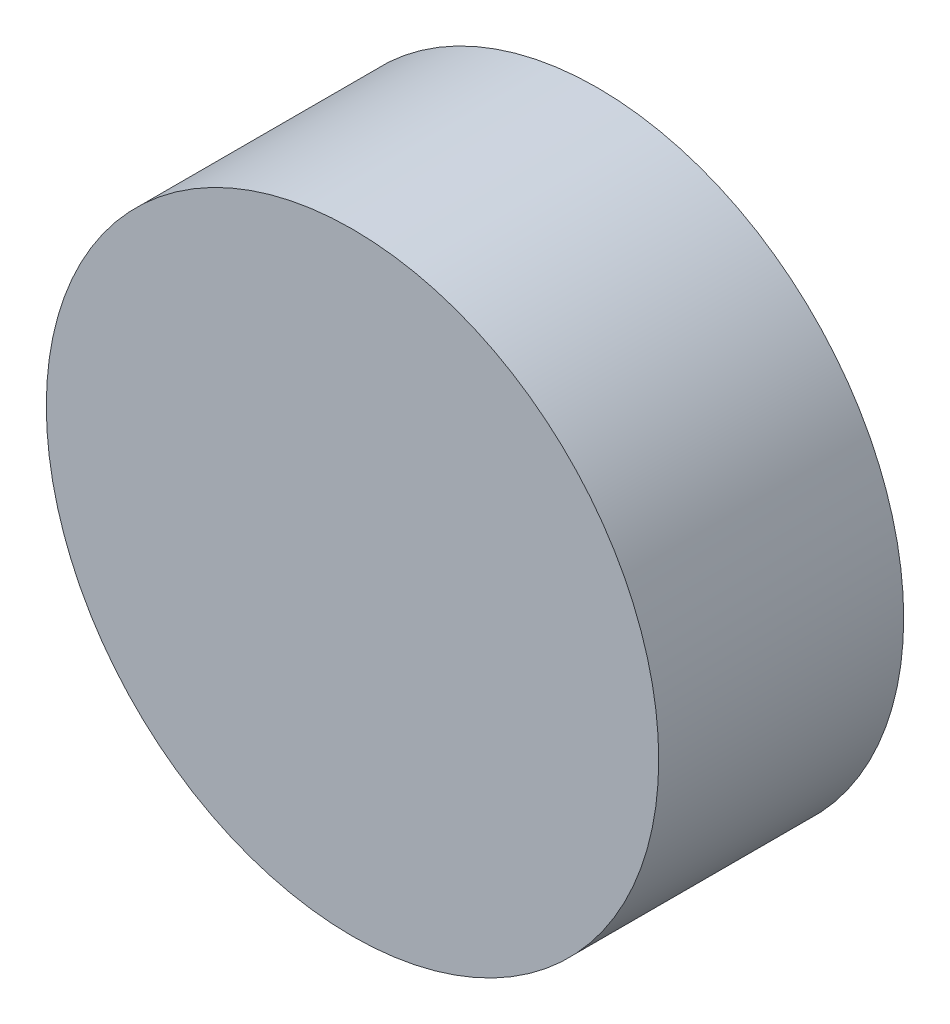
ISO-10303-21;
HEADER;
FILE_DESCRIPTION(('STEP AP214'),'2;1');
FILE_NAME('part.step','',(''),(''),'','','');
FILE_SCHEMA(('AUTOMOTIVE_DESIGN { 1 0 10303 214 1 1 1 1 }'));
ENDSEC;
DATA;
#1=APPLICATION_CONTEXT('core data for automotive mechanical design processes');
#2=APPLICATION_PROTOCOL_DEFINITION('international standard','automotive_design',2000,#1);
#3=PRODUCT_CONTEXT('',#1,'mechanical');
#4=PRODUCT('Part','Part','',(#3));
#5=PRODUCT_RELATED_PRODUCT_CATEGORY('part','',(#4));
#6=PRODUCT_DEFINITION_FORMATION('','',#4);
#7=PRODUCT_DEFINITION_CONTEXT('part definition',#1,'design');
#8=PRODUCT_DEFINITION('design','',#6,#7);
#9=PRODUCT_DEFINITION_SHAPE('','',#8);
#10=(LENGTH_UNIT() NAMED_UNIT(*) SI_UNIT(.MILLI.,.METRE.));
#11=(NAMED_UNIT(*) PLANE_ANGLE_UNIT() SI_UNIT($,.RADIAN.));
#12=(NAMED_UNIT(*) SI_UNIT($,.STERADIAN.) SOLID_ANGLE_UNIT());
#13=UNCERTAINTY_MEASURE_WITH_UNIT(LENGTH_MEASURE(1.E-05),#10,'distance_accuracy_value','');
#14=(GEOMETRIC_REPRESENTATION_CONTEXT(3) GLOBAL_UNCERTAINTY_ASSIGNED_CONTEXT((#13)) GLOBAL_UNIT_ASSIGNED_CONTEXT((#10,
#11,#12)) REPRESENTATION_CONTEXT('',''));
#15=CARTESIAN_POINT('',(0.,0.,0.));
#16=DIRECTION('',(0.,0.,1.));
#17=DIRECTION('',(1.,0.,0.));
#18=AXIS2_PLACEMENT_3D('',#15,#16,#17);
#19=CARTESIAN_POINT('',(-10.,0.,8.));
#20=DIRECTION('',(0.,0.,-1.));
#21=DIRECTION('',(-1.,0.,0.));
#22=AXIS2_PLACEMENT_3D('',#19,#20,#21);
#23=PLANE('',#22);
#24=CARTESIAN_POINT('',(0.,0.,8.));
#25=DIRECTION('',(0.,0.,1.));
#26=DIRECTION('',(1.,0.,0.));
#27=AXIS2_PLACEMENT_3D('',#24,#25,#26);
#28=CIRCLE('',#27,10.);
#29=CARTESIAN_POINT('',(10.,0.,8.));
#30=VERTEX_POINT('',#29);
#31=EDGE_CURVE('E95',#30,#30,#28,.T.);
#32=ORIENTED_EDGE('',*,*,#31,.T.);
#33=EDGE_LOOP('',(#32));
#34=FACE_BOUND('',#33,.T.);
#35=ADVANCED_FACE('F35',(#34),#23,.F.);
#36=CARTESIAN_POINT('',(0.,0.,0.));
#37=DIRECTION('',(0.,0.,1.));
#38=DIRECTION('',(1.,0.,0.));
#39=AXIS2_PLACEMENT_3D('',#36,#37,#38);
#40=PLANE('',#39);
#41=DIRECTION('',(1.,0.,0.));
#42=VECTOR('',#41,1.);
#43=CARTESIAN_POINT('',(0.,-2.,0.));
#44=LINE('',#43,#42);
#45=CARTESIAN_POINT('',(-1.66132477258362,-2.,0.));
#46=VERTEX_POINT('',#45);
#47=CARTESIAN_POINT('',(1.66132477258362,-2.,0.));
#48=VERTEX_POINT('',#47);
#49=EDGE_CURVE('E56',#46,#48,#44,.T.);
#50=ORIENTED_EDGE('',*,*,#49,.T.);
#51=CARTESIAN_POINT('',(0.,0.,0.));
#52=DIRECTION('',(0.,0.,1.));
#53=DIRECTION('',(1.,0.,0.));
#54=AXIS2_PLACEMENT_3D('',#51,#52,#53);
#55=CIRCLE('',#54,2.6);
#56=EDGE_CURVE('E49',#48,#46,#55,.T.);
#57=ORIENTED_EDGE('',*,*,#56,.T.);
#58=EDGE_LOOP('',(#50,#57));
#59=FACE_BOUND('',#58,.T.);
#60=CARTESIAN_POINT('',(0.,0.,0.));
#61=DIRECTION('',(0.,0.,1.));
#62=DIRECTION('',(1.,0.,0.));
#63=AXIS2_PLACEMENT_3D('',#60,#61,#62);
#64=CIRCLE('',#63,10.);
#65=CARTESIAN_POINT('',(10.,0.,0.));
#66=VERTEX_POINT('',#65);
#67=EDGE_CURVE('E99',#66,#66,#64,.T.);
#68=ORIENTED_EDGE('',*,*,#67,.F.);
#69=EDGE_LOOP('',(#68));
#70=FACE_BOUND('',#69,.T.);
#71=ADVANCED_FACE('F116',(#59,#70),#40,.F.);
#72=CARTESIAN_POINT('',(0.,0.,10.353242845035));
#73=DIRECTION('',(0.,0.,1.));
#74=DIRECTION('',(1.,0.,0.));
#75=AXIS2_PLACEMENT_3D('',#72,#73,#74);
#76=CYLINDRICAL_SURFACE('',#75,10.);
#77=ORIENTED_EDGE('',*,*,#31,.F.);
#78=EDGE_LOOP('',(#77));
#79=FACE_BOUND('',#78,.T.);
#80=ORIENTED_EDGE('',*,*,#67,.T.);
#81=EDGE_LOOP('',(#80));
#82=FACE_BOUND('',#81,.T.);
#83=ADVANCED_FACE('F120',(#79,#82),#76,.T.);
#84=CARTESIAN_POINT('',(0.,0.,6.));
#85=DIRECTION('',(0.,0.,-1.));
#86=DIRECTION('',(-1.,0.,0.));
#87=AXIS2_PLACEMENT_3D('',#84,#85,#86);
#88=CYLINDRICAL_SURFACE('',#87,1.6);
#89=DIRECTION('',(0.,0.,-1.));
#90=VECTOR('',#89,1.);
#91=CARTESIAN_POINT('',(-1.24899959967968,-1.,6.));
#92=LINE('',#91,#90);
#93=CARTESIAN_POINT('',(-1.24899959967968,-1.,6.));
#94=VERTEX_POINT('',#93);
#95=CARTESIAN_POINT('',(-1.24899959967968,-1.,1.));
#96=VERTEX_POINT('',#95);
#97=EDGE_CURVE('E86',#94,#96,#92,.T.);
#98=ORIENTED_EDGE('',*,*,#97,.T.);
#99=CARTESIAN_POINT('',(0.,0.,1.));
#100=DIRECTION('',(0.,0.,1.));
#101=DIRECTION('',(1.,0.,0.));
#102=AXIS2_PLACEMENT_3D('',#99,#100,#101);
#103=CIRCLE('',#102,1.6);
#104=CARTESIAN_POINT('',(1.24899959967968,-1.,1.));
#105=VERTEX_POINT('',#104);
#106=EDGE_CURVE('E83',#96,#105,#103,.F.);
#107=ORIENTED_EDGE('',*,*,#106,.T.);
#108=DIRECTION('',(0.,0.,-1.));
#109=VECTOR('',#108,1.);
#110=CARTESIAN_POINT('',(1.24899959967968,-1.,6.));
#111=LINE('',#110,#109);
#112=CARTESIAN_POINT('',(1.24899959967968,-1.,6.));
#113=VERTEX_POINT('',#112);
#114=EDGE_CURVE('E77',#113,#105,#111,.T.);
#115=ORIENTED_EDGE('',*,*,#114,.F.);
#116=CARTESIAN_POINT('',(0.,0.,6.));
#117=DIRECTION('',(0.,0.,-1.));
#118=DIRECTION('',(-1.,0.,0.));
#119=AXIS2_PLACEMENT_3D('',#116,#117,#118);
#120=CIRCLE('',#119,1.6);
#121=EDGE_CURVE('E81',#94,#113,#120,.T.);
#122=ORIENTED_EDGE('',*,*,#121,.F.);
#123=EDGE_LOOP('',(#98,#107,#115,#122));
#124=FACE_BOUND('',#123,.T.);
#125=ADVANCED_FACE('F80',(#124),#88,.F.);
#126=CARTESIAN_POINT('',(-1.24899959967968,-1.,6.));
#127=DIRECTION('',(0.,-1.,0.));
#128=DIRECTION('',(0.,0.,-1.));
#129=AXIS2_PLACEMENT_3D('',#126,#127,#128);
#130=PLANE('',#129);
#131=ORIENTED_EDGE('',*,*,#114,.T.);
#132=DIRECTION('',(-1.,0.,0.));
#133=VECTOR('',#132,1.);
#134=CARTESIAN_POINT('',(-1.24899959967968,-1.,1.));
#135=LINE('',#134,#133);
#136=EDGE_CURVE('E11',#105,#96,#135,.T.);
#137=ORIENTED_EDGE('',*,*,#136,.T.);
#138=ORIENTED_EDGE('',*,*,#97,.F.);
#139=DIRECTION('',(-1.,0.,0.));
#140=VECTOR('',#139,1.);
#141=CARTESIAN_POINT('',(-1.24899959967968,-1.,6.));
#142=LINE('',#141,#140);
#143=EDGE_CURVE('E87',#113,#94,#142,.T.);
#144=ORIENTED_EDGE('',*,*,#143,.F.);
#145=EDGE_LOOP('',(#131,#137,#138,#144));
#146=FACE_BOUND('',#145,.T.);
#147=ADVANCED_FACE('F92',(#146),#130,.F.);
#148=CARTESIAN_POINT('',(0.,0.,6.));
#149=DIRECTION('',(0.,0.,-1.));
#150=DIRECTION('',(-1.,0.,0.));
#151=AXIS2_PLACEMENT_3D('',#148,#149,#150);
#152=PLANE('',#151);
#153=ORIENTED_EDGE('',*,*,#121,.T.);
#154=ORIENTED_EDGE('',*,*,#143,.T.);
#155=EDGE_LOOP('',(#153,#154));
#156=FACE_BOUND('',#155,.T.);
#157=ADVANCED_FACE('F90',(#156),#152,.T.);
#158=CARTESIAN_POINT('',(-1.24899959967968,-1.,1.));
#159=DIRECTION('',(0.,-0.707106781186546,0.707106781186549));
#160=DIRECTION('',(-1.,0.,0.));
#161=AXIS2_PLACEMENT_3D('',#158,#159,#160);
#162=PLANE('',#161);
#163=CARTESIAN_POINT('',(1.24899959967968,-1.,1.));
#164=CARTESIAN_POINT('',(1.28846895106238,-1.08224919513711,0.917750804862888));
#165=CARTESIAN_POINT('',(1.32633104863741,-1.16487304088687,0.835126959113131));
#166=CARTESIAN_POINT('',(1.39935034151462,-1.33068490080962,0.66931509919038));
#167=CARTESIAN_POINT('',(1.43450851358712,-1.41387269933023,0.586127300669774));
#168=CARTESIAN_POINT('',(1.50265040070497,-1.58067000064314,0.419329999356866));
#169=CARTESIAN_POINT('',(1.53563456427039,-1.66427941259631,0.335720587403692));
#170=CARTESIAN_POINT('',(1.59977380875364,-1.83188128440234,0.168118715597661));
#171=CARTESIAN_POINT('',(1.63092822622151,-1.91587387143958,0.084126128560429));
#172=CARTESIAN_POINT('',(1.66132477258362,-2.,0.));
#173=B_SPLINE_CURVE_WITH_KNOTS('',3,(#163,#164,#165,#166,#167,#168,#169,#170,#171,#172),
.UNSPECIFIED.,.F.,.F.,(4,2,2,2,4),(0.,0.368463099531998,0.736792463494291,1.10504559795062,
1.47343144374605),.UNSPECIFIED.);
#174=EDGE_CURVE('E104',#48,#105,#173,.F.);
#175=ORIENTED_EDGE('',*,*,#174,.F.);
#176=ORIENTED_EDGE('',*,*,#49,.F.);
#177=CARTESIAN_POINT('',(-1.66132477258362,-2.,0.));
#178=CARTESIAN_POINT('',(-1.63092822622151,-1.91587387143958,0.084126128560428));
#179=CARTESIAN_POINT('',(-1.59977380875364,-1.83188128440234,0.16811871559766));
#180=CARTESIAN_POINT('',(-1.53563456427039,-1.66427941259631,0.335720587403691));
#181=CARTESIAN_POINT('',(-1.50265040070497,-1.58067000064314,0.419329999356866));
#182=CARTESIAN_POINT('',(-1.43450851358712,-1.41387269933023,0.586127300669774));
#183=CARTESIAN_POINT('',(-1.39935034151462,-1.33068490080962,0.66931509919038));
#184=CARTESIAN_POINT('',(-1.32633104863741,-1.16487304088687,0.835126959113131));
#185=CARTESIAN_POINT('',(-1.28846895106238,-1.08224919513711,0.917750804862888));
#186=CARTESIAN_POINT('',(-1.24899959967968,-1.,1.));
#187=B_SPLINE_CURVE_WITH_KNOTS('',3,(#177,#178,#179,#180,#181,#182,#183,#184,#185,#186),
.UNSPECIFIED.,.F.,.F.,(4,2,2,2,4),(0.,0.368385845795425,0.736638980251758,1.10496834421405,
1.47343144374605),.UNSPECIFIED.);
#188=EDGE_CURVE('E40',#96,#46,#187,.F.);
#189=ORIENTED_EDGE('',*,*,#188,.F.);
#190=ORIENTED_EDGE('',*,*,#136,.F.);
#191=EDGE_LOOP('',(#175,#176,#189,#190));
#192=FACE_BOUND('',#191,.T.);
#193=ADVANCED_FACE('F37',(#192),#162,.F.);
#194=CARTESIAN_POINT('',(0.,0.,1.));
#195=DIRECTION('',(0.,0.,-1.));
#196=DIRECTION('',(-1.,0.,0.));
#197=AXIS2_PLACEMENT_3D('',#194,#195,#196);
#198=CONICAL_SURFACE('',#197,1.6,0.78539816339745);
#199=ORIENTED_EDGE('',*,*,#188,.T.);
#200=ORIENTED_EDGE('',*,*,#56,.F.);
#201=ORIENTED_EDGE('',*,*,#174,.T.);
#202=ORIENTED_EDGE('',*,*,#106,.F.);
#203=EDGE_LOOP('',(#199,#200,#201,#202));
#204=FACE_BOUND('',#203,.T.);
#205=ADVANCED_FACE('F109',(#204),#198,.F.);
#206=CLOSED_SHELL('',(#35,#71,#83,#125,#147,#157,#193,#205));
#207=MANIFOLD_SOLID_BREP('B2',#206);
#208=ADVANCED_BREP_SHAPE_REPRESENTATION('',(#18,#207),#14);
#209=SHAPE_DEFINITION_REPRESENTATION(#9,#208);
ENDSEC;
END-ISO-10303-21;
